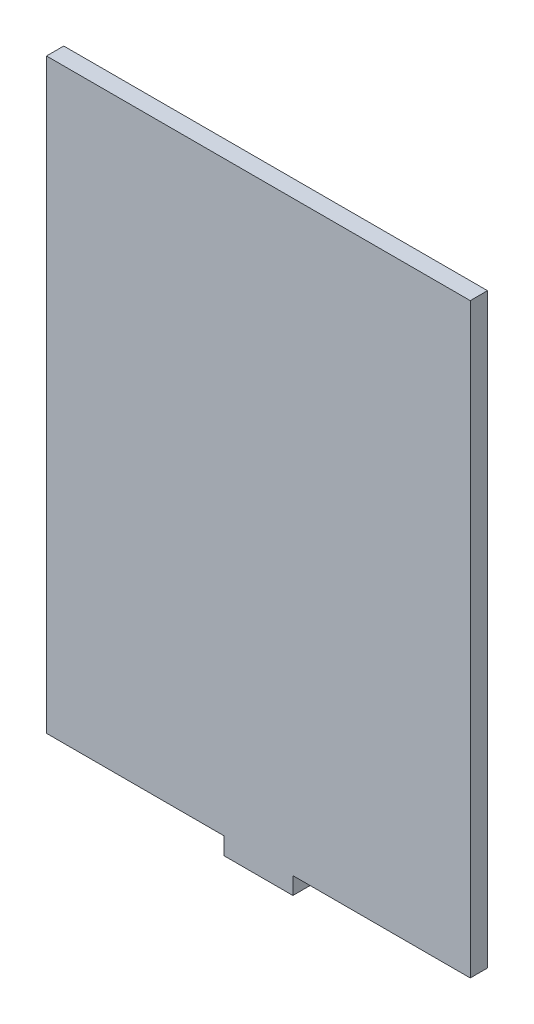
ISO-10303-21;
HEADER;
FILE_DESCRIPTION(('STEP AP214'),'2;1');
FILE_NAME('part.step','',(''),(''),'','','');
FILE_SCHEMA(('AUTOMOTIVE_DESIGN { 1 0 10303 214 1 1 1 1 }'));
ENDSEC;
DATA;
#1=APPLICATION_CONTEXT('core data for automotive mechanical design processes');
#2=APPLICATION_PROTOCOL_DEFINITION('international standard','automotive_design',2000,#1);
#3=PRODUCT_CONTEXT('',#1,'mechanical');
#4=PRODUCT('Part','Part','',(#3));
#5=PRODUCT_RELATED_PRODUCT_CATEGORY('part','',(#4));
#6=PRODUCT_DEFINITION_FORMATION('','',#4);
#7=PRODUCT_DEFINITION_CONTEXT('part definition',#1,'design');
#8=PRODUCT_DEFINITION('design','',#6,#7);
#9=PRODUCT_DEFINITION_SHAPE('','',#8);
#10=(LENGTH_UNIT() NAMED_UNIT(*) SI_UNIT(.MILLI.,.METRE.));
#11=(NAMED_UNIT(*) PLANE_ANGLE_UNIT() SI_UNIT($,.RADIAN.));
#12=(NAMED_UNIT(*) SI_UNIT($,.STERADIAN.) SOLID_ANGLE_UNIT());
#13=UNCERTAINTY_MEASURE_WITH_UNIT(LENGTH_MEASURE(1.E-05),#10,'distance_accuracy_value','');
#14=(GEOMETRIC_REPRESENTATION_CONTEXT(3) GLOBAL_UNCERTAINTY_ASSIGNED_CONTEXT((#13)) GLOBAL_UNIT_ASSIGNED_CONTEXT((#10,
#11,#12)) REPRESENTATION_CONTEXT('',''));
#15=CARTESIAN_POINT('',(0.,0.,0.));
#16=DIRECTION('',(0.,0.,1.));
#17=DIRECTION('',(1.,0.,0.));
#18=AXIS2_PLACEMENT_3D('',#15,#16,#17);
#19=CARTESIAN_POINT('',(61.4,-85.,5.));
#20=DIRECTION('',(-1.,0.,0.));
#21=DIRECTION('',(0.,0.,1.));
#22=AXIS2_PLACEMENT_3D('',#19,#20,#21);
#23=PLANE('',#22);
#24=DIRECTION('',(0.,1.,0.));
#25=VECTOR('',#24,1.);
#26=CARTESIAN_POINT('',(61.4,-85.,0.));
#27=LINE('',#26,#25);
#28=CARTESIAN_POINT('',(61.4,-85.,0.));
#29=VERTEX_POINT('',#28);
#30=CARTESIAN_POINT('',(61.4,85.,0.));
#31=VERTEX_POINT('',#30);
#32=EDGE_CURVE('E129',#29,#31,#27,.T.);
#33=ORIENTED_EDGE('',*,*,#32,.T.);
#34=DIRECTION('',(0.,0.,-1.));
#35=VECTOR('',#34,1.);
#36=CARTESIAN_POINT('',(61.4,85.,5.));
#37=LINE('',#36,#35);
#38=CARTESIAN_POINT('',(61.4,85.,5.));
#39=VERTEX_POINT('',#38);
#40=EDGE_CURVE('E11',#39,#31,#37,.T.);
#41=ORIENTED_EDGE('',*,*,#40,.F.);
#42=DIRECTION('',(0.,1.,0.));
#43=VECTOR('',#42,1.);
#44=CARTESIAN_POINT('',(61.4,-85.,5.));
#45=LINE('',#44,#43);
#46=CARTESIAN_POINT('',(61.4,-85.,5.));
#47=VERTEX_POINT('',#46);
#48=EDGE_CURVE('E143',#47,#39,#45,.T.);
#49=ORIENTED_EDGE('',*,*,#48,.F.);
#50=DIRECTION('',(0.,0.,-1.));
#51=VECTOR('',#50,1.);
#52=CARTESIAN_POINT('',(61.4,-85.,5.));
#53=LINE('',#52,#51);
#54=EDGE_CURVE('E125',#47,#29,#53,.T.);
#55=ORIENTED_EDGE('',*,*,#54,.T.);
#56=EDGE_LOOP('',(#33,#41,#49,#55));
#57=FACE_BOUND('',#56,.T.);
#58=ADVANCED_FACE('F33',(#57),#23,.F.);
#59=CARTESIAN_POINT('',(-61.4,85.,5.));
#60=DIRECTION('',(0.,-1.,0.));
#61=DIRECTION('',(0.,0.,-1.));
#62=AXIS2_PLACEMENT_3D('',#59,#60,#61);
#63=PLANE('',#62);
#64=DIRECTION('',(-1.,0.,0.));
#65=VECTOR('',#64,1.);
#66=CARTESIAN_POINT('',(-61.4,85.,0.));
#67=LINE('',#66,#65);
#68=CARTESIAN_POINT('',(-61.4,85.,0.));
#69=VERTEX_POINT('',#68);
#70=EDGE_CURVE('E132',#31,#69,#67,.T.);
#71=ORIENTED_EDGE('',*,*,#70,.T.);
#72=DIRECTION('',(0.,0.,-1.));
#73=VECTOR('',#72,1.);
#74=CARTESIAN_POINT('',(-61.4,85.,5.));
#75=LINE('',#74,#73);
#76=CARTESIAN_POINT('',(-61.4,85.,5.));
#77=VERTEX_POINT('',#76);
#78=EDGE_CURVE('E41',#77,#69,#75,.T.);
#79=ORIENTED_EDGE('',*,*,#78,.F.);
#80=DIRECTION('',(-1.,0.,0.));
#81=VECTOR('',#80,1.);
#82=CARTESIAN_POINT('',(-61.4,85.,5.));
#83=LINE('',#82,#81);
#84=EDGE_CURVE('E92',#39,#77,#83,.T.);
#85=ORIENTED_EDGE('',*,*,#84,.F.);
#86=ORIENTED_EDGE('',*,*,#40,.T.);
#87=EDGE_LOOP('',(#71,#79,#85,#86));
#88=FACE_BOUND('',#87,.T.);
#89=ADVANCED_FACE('F178',(#88),#63,.F.);
#90=CARTESIAN_POINT('',(-61.4,-85.,5.));
#91=DIRECTION('',(1.,0.,0.));
#92=DIRECTION('',(0.,0.,-1.));
#93=AXIS2_PLACEMENT_3D('',#90,#91,#92);
#94=PLANE('',#93);
#95=DIRECTION('',(0.,-1.,0.));
#96=VECTOR('',#95,1.);
#97=CARTESIAN_POINT('',(-61.4,-85.,0.));
#98=LINE('',#97,#96);
#99=CARTESIAN_POINT('',(-61.4,-85.,0.));
#100=VERTEX_POINT('',#99);
#101=EDGE_CURVE('E134',#69,#100,#98,.T.);
#102=ORIENTED_EDGE('',*,*,#101,.T.);
#103=DIRECTION('',(0.,0.,-1.));
#104=VECTOR('',#103,1.);
#105=CARTESIAN_POINT('',(-61.4,-85.,5.));
#106=LINE('',#105,#104);
#107=CARTESIAN_POINT('',(-61.4,-85.,5.));
#108=VERTEX_POINT('',#107);
#109=EDGE_CURVE('E150',#108,#100,#106,.T.);
#110=ORIENTED_EDGE('',*,*,#109,.F.);
#111=DIRECTION('',(0.,-1.,0.));
#112=VECTOR('',#111,1.);
#113=CARTESIAN_POINT('',(-61.4,-85.,5.));
#114=LINE('',#113,#112);
#115=EDGE_CURVE('E158',#77,#108,#114,.T.);
#116=ORIENTED_EDGE('',*,*,#115,.F.);
#117=ORIENTED_EDGE('',*,*,#78,.T.);
#118=EDGE_LOOP('',(#102,#110,#116,#117));
#119=FACE_BOUND('',#118,.T.);
#120=ADVANCED_FACE('F156',(#119),#94,.F.);
#121=CARTESIAN_POINT('',(-61.4,-85.,5.));
#122=DIRECTION('',(0.,1.,0.));
#123=DIRECTION('',(0.,0.,1.));
#124=AXIS2_PLACEMENT_3D('',#121,#122,#123);
#125=PLANE('',#124);
#126=DIRECTION('',(1.,0.,0.));
#127=VECTOR('',#126,1.);
#128=CARTESIAN_POINT('',(-61.4,-85.,0.));
#129=LINE('',#128,#127);
#130=CARTESIAN_POINT('',(-10.,-85.,0.));
#131=VERTEX_POINT('',#130);
#132=EDGE_CURVE('E136',#100,#131,#129,.T.);
#133=ORIENTED_EDGE('',*,*,#132,.T.);
#134=DIRECTION('',(0.,0.,-1.));
#135=VECTOR('',#134,1.);
#136=CARTESIAN_POINT('',(-10.,-85.,5.));
#137=LINE('',#136,#135);
#138=CARTESIAN_POINT('',(-10.,-85.,5.));
#139=VERTEX_POINT('',#138);
#140=EDGE_CURVE('E147',#139,#131,#137,.T.);
#141=ORIENTED_EDGE('',*,*,#140,.F.);
#142=DIRECTION('',(1.,0.,0.));
#143=VECTOR('',#142,1.);
#144=CARTESIAN_POINT('',(-61.4,-85.,5.));
#145=LINE('',#144,#143);
#146=EDGE_CURVE('E170',#108,#139,#145,.T.);
#147=ORIENTED_EDGE('',*,*,#146,.F.);
#148=ORIENTED_EDGE('',*,*,#109,.T.);
#149=EDGE_LOOP('',(#133,#141,#147,#148));
#150=FACE_BOUND('',#149,.T.);
#151=ADVANCED_FACE('F166',(#150),#125,.F.);
#152=CARTESIAN_POINT('',(-10.,-85.,5.));
#153=DIRECTION('',(1.,0.,0.));
#154=DIRECTION('',(0.,0.,-1.));
#155=AXIS2_PLACEMENT_3D('',#152,#153,#154);
#156=PLANE('',#155);
#157=DIRECTION('',(0.,-1.,0.));
#158=VECTOR('',#157,1.);
#159=CARTESIAN_POINT('',(-10.,-85.,0.));
#160=LINE('',#159,#158);
#161=CARTESIAN_POINT('',(-10.,-90.,0.));
#162=VERTEX_POINT('',#161);
#163=EDGE_CURVE('E138',#131,#162,#160,.T.);
#164=ORIENTED_EDGE('',*,*,#163,.T.);
#165=DIRECTION('',(0.,0.,-1.));
#166=VECTOR('',#165,1.);
#167=CARTESIAN_POINT('',(-10.,-90.,5.));
#168=LINE('',#167,#166);
#169=CARTESIAN_POINT('',(-10.,-90.,5.));
#170=VERTEX_POINT('',#169);
#171=EDGE_CURVE('E120',#170,#162,#168,.T.);
#172=ORIENTED_EDGE('',*,*,#171,.F.);
#173=DIRECTION('',(0.,-1.,0.));
#174=VECTOR('',#173,1.);
#175=CARTESIAN_POINT('',(-10.,-85.,5.));
#176=LINE('',#175,#174);
#177=EDGE_CURVE('E111',#139,#170,#176,.T.);
#178=ORIENTED_EDGE('',*,*,#177,.F.);
#179=ORIENTED_EDGE('',*,*,#140,.T.);
#180=EDGE_LOOP('',(#164,#172,#178,#179));
#181=FACE_BOUND('',#180,.T.);
#182=ADVANCED_FACE('F169',(#181),#156,.F.);
#183=CARTESIAN_POINT('',(-10.,-90.,5.));
#184=DIRECTION('',(0.,1.,0.));
#185=DIRECTION('',(0.,0.,1.));
#186=AXIS2_PLACEMENT_3D('',#183,#184,#185);
#187=PLANE('',#186);
#188=DIRECTION('',(1.,0.,0.));
#189=VECTOR('',#188,1.);
#190=CARTESIAN_POINT('',(-10.,-90.,0.));
#191=LINE('',#190,#189);
#192=CARTESIAN_POINT('',(9.99999999999998,-90.,0.));
#193=VERTEX_POINT('',#192);
#194=EDGE_CURVE('E119',#162,#193,#191,.T.);
#195=ORIENTED_EDGE('',*,*,#194,.T.);
#196=DIRECTION('',(0.,0.,-1.));
#197=VECTOR('',#196,1.);
#198=CARTESIAN_POINT('',(9.99999999999998,-90.,5.));
#199=LINE('',#198,#197);
#200=CARTESIAN_POINT('',(9.99999999999998,-90.,5.));
#201=VERTEX_POINT('',#200);
#202=EDGE_CURVE('E116',#201,#193,#199,.T.);
#203=ORIENTED_EDGE('',*,*,#202,.F.);
#204=DIRECTION('',(1.,0.,0.));
#205=VECTOR('',#204,1.);
#206=CARTESIAN_POINT('',(-10.,-90.,5.));
#207=LINE('',#206,#205);
#208=EDGE_CURVE('E105',#170,#201,#207,.T.);
#209=ORIENTED_EDGE('',*,*,#208,.F.);
#210=ORIENTED_EDGE('',*,*,#171,.T.);
#211=EDGE_LOOP('',(#195,#203,#209,#210));
#212=FACE_BOUND('',#211,.T.);
#213=ADVANCED_FACE('F117',(#212),#187,.F.);
#214=CARTESIAN_POINT('',(9.99999999999998,-90.,5.));
#215=DIRECTION('',(-1.,0.,0.));
#216=DIRECTION('',(0.,-1.,0.));
#217=AXIS2_PLACEMENT_3D('',#214,#215,#216);
#218=PLANE('',#217);
#219=DIRECTION('',(0.,1.,0.));
#220=VECTOR('',#219,1.);
#221=CARTESIAN_POINT('',(9.99999999999998,-90.,0.));
#222=LINE('',#221,#220);
#223=CARTESIAN_POINT('',(10.,-85.,0.));
#224=VERTEX_POINT('',#223);
#225=EDGE_CURVE('E78',#193,#224,#222,.T.);
#226=ORIENTED_EDGE('',*,*,#225,.T.);
#227=DIRECTION('',(0.,0.,-1.));
#228=VECTOR('',#227,1.);
#229=CARTESIAN_POINT('',(10.,-85.,5.));
#230=LINE('',#229,#228);
#231=CARTESIAN_POINT('',(10.,-85.,5.));
#232=VERTEX_POINT('',#231);
#233=EDGE_CURVE('E121',#232,#224,#230,.T.);
#234=ORIENTED_EDGE('',*,*,#233,.F.);
#235=DIRECTION('',(0.,1.,0.));
#236=VECTOR('',#235,1.);
#237=CARTESIAN_POINT('',(9.99999999999998,-90.,5.));
#238=LINE('',#237,#236);
#239=EDGE_CURVE('E109',#201,#232,#238,.T.);
#240=ORIENTED_EDGE('',*,*,#239,.F.);
#241=ORIENTED_EDGE('',*,*,#202,.T.);
#242=EDGE_LOOP('',(#226,#234,#240,#241));
#243=FACE_BOUND('',#242,.T.);
#244=ADVANCED_FACE('F123',(#243),#218,.F.);
#245=CARTESIAN_POINT('',(10.,-85.,5.));
#246=DIRECTION('',(0.,1.,0.));
#247=DIRECTION('',(0.,0.,1.));
#248=AXIS2_PLACEMENT_3D('',#245,#246,#247);
#249=PLANE('',#248);
#250=DIRECTION('',(1.,0.,0.));
#251=VECTOR('',#250,1.);
#252=CARTESIAN_POINT('',(10.,-85.,0.));
#253=LINE('',#252,#251);
#254=EDGE_CURVE('E84',#224,#29,#253,.T.);
#255=ORIENTED_EDGE('',*,*,#254,.T.);
#256=ORIENTED_EDGE('',*,*,#54,.F.);
#257=DIRECTION('',(1.,0.,0.));
#258=VECTOR('',#257,1.);
#259=CARTESIAN_POINT('',(10.,-85.,5.));
#260=LINE('',#259,#258);
#261=EDGE_CURVE('E49',#232,#47,#260,.T.);
#262=ORIENTED_EDGE('',*,*,#261,.F.);
#263=ORIENTED_EDGE('',*,*,#233,.T.);
#264=EDGE_LOOP('',(#255,#256,#262,#263));
#265=FACE_BOUND('',#264,.T.);
#266=ADVANCED_FACE('F194',(#265),#249,.F.);
#267=CARTESIAN_POINT('',(0.,0.,5.));
#268=DIRECTION('',(0.,0.,-1.));
#269=DIRECTION('',(-1.,0.,0.));
#270=AXIS2_PLACEMENT_3D('',#267,#268,#269);
#271=PLANE('',#270);
#272=ORIENTED_EDGE('',*,*,#48,.T.);
#273=ORIENTED_EDGE('',*,*,#84,.T.);
#274=ORIENTED_EDGE('',*,*,#115,.T.);
#275=ORIENTED_EDGE('',*,*,#146,.T.);
#276=ORIENTED_EDGE('',*,*,#177,.T.);
#277=ORIENTED_EDGE('',*,*,#208,.T.);
#278=ORIENTED_EDGE('',*,*,#239,.T.);
#279=ORIENTED_EDGE('',*,*,#261,.T.);
#280=EDGE_LOOP('',(#272,#273,#274,#275,#276,#277,#278,#279));
#281=FACE_BOUND('',#280,.T.);
#282=ADVANCED_FACE('F107',(#281),#271,.F.);
#283=CARTESIAN_POINT('',(0.,0.,0.));
#284=DIRECTION('',(0.,0.,-1.));
#285=DIRECTION('',(-1.,0.,0.));
#286=AXIS2_PLACEMENT_3D('',#283,#284,#285);
#287=PLANE('',#286);
#288=ORIENTED_EDGE('',*,*,#32,.F.);
#289=ORIENTED_EDGE('',*,*,#254,.F.);
#290=ORIENTED_EDGE('',*,*,#225,.F.);
#291=ORIENTED_EDGE('',*,*,#194,.F.);
#292=ORIENTED_EDGE('',*,*,#163,.F.);
#293=ORIENTED_EDGE('',*,*,#132,.F.);
#294=ORIENTED_EDGE('',*,*,#101,.F.);
#295=ORIENTED_EDGE('',*,*,#70,.F.);
#296=EDGE_LOOP('',(#288,#289,#290,#291,#292,#293,#294,#295));
#297=FACE_BOUND('',#296,.T.);
#298=ADVANCED_FACE('F162',(#297),#287,.T.);
#299=CLOSED_SHELL('',(#58,#89,#120,#151,#182,#213,#244,#266,#282,#298));
#300=MANIFOLD_SOLID_BREP('B2',#299);
#301=ADVANCED_BREP_SHAPE_REPRESENTATION('',(#18,#300),#14);
#302=SHAPE_DEFINITION_REPRESENTATION(#9,#301);
ENDSEC;
END-ISO-10303-21;
